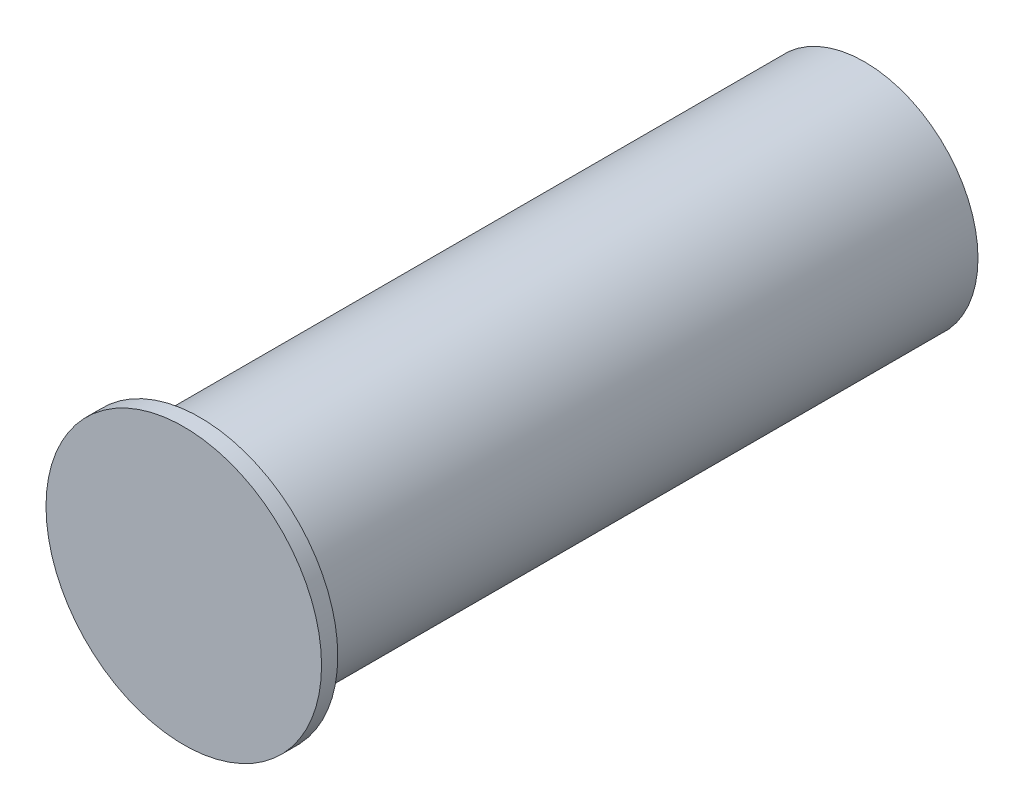
ISO-10303-21;
HEADER;
FILE_DESCRIPTION(('STEP AP214'),'2;1');
FILE_NAME('part.step','',(''),(''),'','','');
FILE_SCHEMA(('AUTOMOTIVE_DESIGN { 1 0 10303 214 1 1 1 1 }'));
ENDSEC;
DATA;
#1=APPLICATION_CONTEXT('core data for automotive mechanical design processes');
#2=APPLICATION_PROTOCOL_DEFINITION('international standard','automotive_design',2000,#1);
#3=PRODUCT_CONTEXT('',#1,'mechanical');
#4=PRODUCT('Part','Part','',(#3));
#5=PRODUCT_RELATED_PRODUCT_CATEGORY('part','',(#4));
#6=PRODUCT_DEFINITION_FORMATION('','',#4);
#7=PRODUCT_DEFINITION_CONTEXT('part definition',#1,'design');
#8=PRODUCT_DEFINITION('design','',#6,#7);
#9=PRODUCT_DEFINITION_SHAPE('','',#8);
#10=(LENGTH_UNIT() NAMED_UNIT(*) SI_UNIT(.MILLI.,.METRE.));
#11=(NAMED_UNIT(*) PLANE_ANGLE_UNIT() SI_UNIT($,.RADIAN.));
#12=(NAMED_UNIT(*) SI_UNIT($,.STERADIAN.) SOLID_ANGLE_UNIT());
#13=UNCERTAINTY_MEASURE_WITH_UNIT(LENGTH_MEASURE(1.E-05),#10,'distance_accuracy_value','');
#14=(GEOMETRIC_REPRESENTATION_CONTEXT(3) GLOBAL_UNCERTAINTY_ASSIGNED_CONTEXT((#13)) GLOBAL_UNIT_ASSIGNED_CONTEXT((#10,
#11,#12)) REPRESENTATION_CONTEXT('',''));
#15=CARTESIAN_POINT('',(0.,0.,0.));
#16=DIRECTION('',(0.,0.,1.));
#17=DIRECTION('',(1.,0.,0.));
#18=AXIS2_PLACEMENT_3D('',#15,#16,#17);
#19=CARTESIAN_POINT('',(0.,0.,-10.414));
#20=DIRECTION('',(0.,0.,1.));
#21=DIRECTION('',(1.,0.,0.));
#22=AXIS2_PLACEMENT_3D('',#19,#20,#21);
#23=CYLINDRICAL_SURFACE('',#22,1.778);
#24=CARTESIAN_POINT('',(0.,0.,-10.414));
#25=DIRECTION('',(0.,0.,1.));
#26=DIRECTION('',(1.,0.,0.));
#27=AXIS2_PLACEMENT_3D('',#24,#25,#26);
#28=CIRCLE('',#27,1.778);
#29=CARTESIAN_POINT('',(1.778,0.,-10.414));
#30=VERTEX_POINT('',#29);
#31=EDGE_CURVE('E10',#30,#30,#28,.T.);
#32=ORIENTED_EDGE('',*,*,#31,.T.);
#33=EDGE_LOOP('',(#32));
#34=FACE_BOUND('',#33,.T.);
#35=CARTESIAN_POINT('',(0.,0.,0.));
#36=DIRECTION('',(0.,0.,1.));
#37=DIRECTION('',(1.,0.,0.));
#38=AXIS2_PLACEMENT_3D('',#35,#36,#37);
#39=CIRCLE('',#38,1.778);
#40=CARTESIAN_POINT('',(1.778,0.,0.));
#41=VERTEX_POINT('',#40);
#42=EDGE_CURVE('E33',#41,#41,#39,.T.);
#43=ORIENTED_EDGE('',*,*,#42,.F.);
#44=EDGE_LOOP('',(#43));
#45=FACE_BOUND('',#44,.T.);
#46=ADVANCED_FACE('F30',(#34,#45),#23,.T.);
#47=CARTESIAN_POINT('',(0.,0.,-10.414));
#48=DIRECTION('',(0.,0.,1.));
#49=DIRECTION('',(1.,0.,0.));
#50=AXIS2_PLACEMENT_3D('',#47,#48,#49);
#51=PLANE('',#50);
#52=ORIENTED_EDGE('',*,*,#31,.F.);
#53=EDGE_LOOP('',(#52));
#54=FACE_BOUND('',#53,.T.);
#55=ADVANCED_FACE('F53',(#54),#51,.F.);
#56=CARTESIAN_POINT('',(0.,0.,0.253999999999998));
#57=DIRECTION('',(0.,0.,-1.));
#58=DIRECTION('',(-1.,0.,0.));
#59=AXIS2_PLACEMENT_3D('',#56,#57,#58);
#60=CYLINDRICAL_SURFACE('',#59,2.159);
#61=CARTESIAN_POINT('',(0.,0.,0.253999999999998));
#62=DIRECTION('',(0.,0.,1.));
#63=DIRECTION('',(1.,0.,0.));
#64=AXIS2_PLACEMENT_3D('',#61,#62,#63);
#65=CIRCLE('',#64,2.159);
#66=CARTESIAN_POINT('',(2.159,0.,0.253999999999998));
#67=VERTEX_POINT('',#66);
#68=EDGE_CURVE('E40',#67,#67,#65,.T.);
#69=ORIENTED_EDGE('',*,*,#68,.F.);
#70=EDGE_LOOP('',(#69));
#71=FACE_BOUND('',#70,.T.);
#72=CARTESIAN_POINT('',(0.,0.,0.));
#73=DIRECTION('',(0.,0.,1.));
#74=DIRECTION('',(1.,0.,0.));
#75=AXIS2_PLACEMENT_3D('',#72,#73,#74);
#76=CIRCLE('',#75,2.159);
#77=CARTESIAN_POINT('',(2.159,0.,0.));
#78=VERTEX_POINT('',#77);
#79=EDGE_CURVE('E42',#78,#78,#76,.T.);
#80=ORIENTED_EDGE('',*,*,#79,.T.);
#81=EDGE_LOOP('',(#80));
#82=FACE_BOUND('',#81,.T.);
#83=ADVANCED_FACE('F50',(#71,#82),#60,.T.);
#84=CARTESIAN_POINT('',(0.,0.,0.253999999999998));
#85=DIRECTION('',(0.,0.,1.));
#86=DIRECTION('',(1.,0.,0.));
#87=AXIS2_PLACEMENT_3D('',#84,#85,#86);
#88=PLANE('',#87);
#89=ORIENTED_EDGE('',*,*,#68,.T.);
#90=EDGE_LOOP('',(#89));
#91=FACE_BOUND('',#90,.T.);
#92=ADVANCED_FACE('F48',(#91),#88,.T.);
#93=CARTESIAN_POINT('',(0.,0.,0.));
#94=DIRECTION('',(0.,0.,1.));
#95=DIRECTION('',(1.,0.,0.));
#96=AXIS2_PLACEMENT_3D('',#93,#94,#95);
#97=PLANE('',#96);
#98=ORIENTED_EDGE('',*,*,#42,.T.);
#99=EDGE_LOOP('',(#98));
#100=FACE_BOUND('',#99,.T.);
#101=ORIENTED_EDGE('',*,*,#79,.F.);
#102=EDGE_LOOP('',(#101));
#103=FACE_BOUND('',#102,.T.);
#104=ADVANCED_FACE('F57',(#100,#103),#97,.F.);
#105=CLOSED_SHELL('',(#46,#55,#83,#92,#104));
#106=MANIFOLD_SOLID_BREP('B2',#105);
#107=ADVANCED_BREP_SHAPE_REPRESENTATION('',(#18,#106),#14);
#108=SHAPE_DEFINITION_REPRESENTATION(#9,#107);
ENDSEC;
END-ISO-10303-21;
